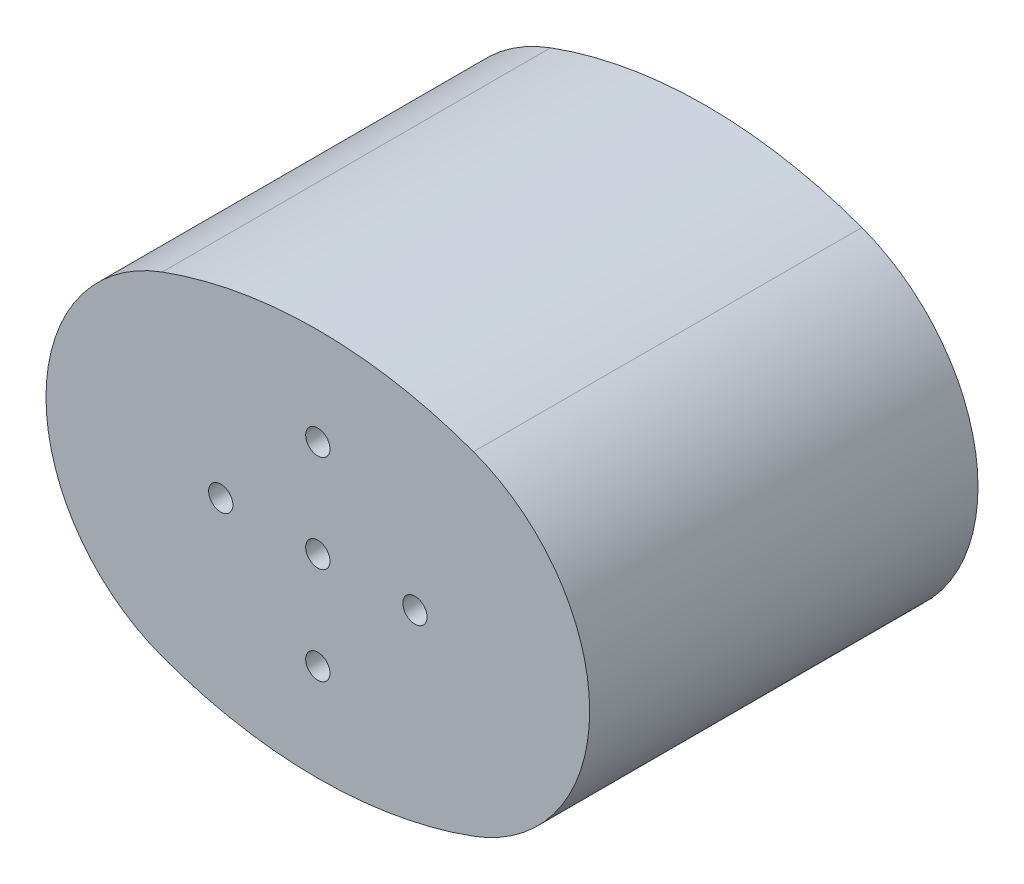
ISO-10303-21;
HEADER;
FILE_DESCRIPTION(('STEP AP214'),'2;1');
FILE_NAME('part.step','',(''),(''),'','','');
FILE_SCHEMA(('AUTOMOTIVE_DESIGN { 1 0 10303 214 1 1 1 1 }'));
ENDSEC;
DATA;
#1=APPLICATION_CONTEXT('core data for automotive mechanical design processes');
#2=APPLICATION_PROTOCOL_DEFINITION('international standard','automotive_design',2000,#1);
#3=PRODUCT_CONTEXT('',#1,'mechanical');
#4=PRODUCT('Part','Part','',(#3));
#5=PRODUCT_RELATED_PRODUCT_CATEGORY('part','',(#4));
#6=PRODUCT_DEFINITION_FORMATION('','',#4);
#7=PRODUCT_DEFINITION_CONTEXT('part definition',#1,'design');
#8=PRODUCT_DEFINITION('design','',#6,#7);
#9=PRODUCT_DEFINITION_SHAPE('','',#8);
#10=(LENGTH_UNIT() NAMED_UNIT(*) SI_UNIT(.MILLI.,.METRE.));
#11=(NAMED_UNIT(*) PLANE_ANGLE_UNIT() SI_UNIT($,.RADIAN.));
#12=(NAMED_UNIT(*) SI_UNIT($,.STERADIAN.) SOLID_ANGLE_UNIT());
#13=UNCERTAINTY_MEASURE_WITH_UNIT(LENGTH_MEASURE(1.E-05),#10,'distance_accuracy_value','');
#14=(GEOMETRIC_REPRESENTATION_CONTEXT(3) GLOBAL_UNCERTAINTY_ASSIGNED_CONTEXT((#13)) GLOBAL_UNIT_ASSIGNED_CONTEXT((#10,
#11,#12)) REPRESENTATION_CONTEXT('',''));
#15=CARTESIAN_POINT('',(0.,0.,0.));
#16=DIRECTION('',(0.,0.,1.));
#17=DIRECTION('',(1.,0.,0.));
#18=AXIS2_PLACEMENT_3D('',#15,#16,#17);
#19=CARTESIAN_POINT('',(0.,26.4889586669029,40.));
#20=DIRECTION('',(0.,0.,-1.));
#21=DIRECTION('',(-1.,0.,0.));
#22=AXIS2_PLACEMENT_3D('',#19,#20,#21);
#23=CYLINDRICAL_SURFACE('',#22,46.4889586669031);
#24=CARTESIAN_POINT('',(0.,26.4889586669029,0.));
#25=DIRECTION('',(0.,0.,1.));
#26=DIRECTION('',(1.,0.,0.));
#27=AXIS2_PLACEMENT_3D('',#24,#25,#26);
#28=CIRCLE('',#27,46.4889586669031);
#29=CARTESIAN_POINT('',(-16.0303859502735,-17.1487544287475,0.));
#30=VERTEX_POINT('',#29);
#31=CARTESIAN_POINT('',(16.0303859502735,-17.1487544287475,0.));
#32=VERTEX_POINT('',#31);
#33=EDGE_CURVE('E95',#30,#32,#28,.T.);
#34=ORIENTED_EDGE('',*,*,#33,.T.);
#35=DIRECTION('',(0.,0.,-1.));
#36=VECTOR('',#35,1.);
#37=CARTESIAN_POINT('',(16.0303859502735,-17.1487544287475,40.));
#38=LINE('',#37,#36);
#39=CARTESIAN_POINT('',(16.0303859502735,-17.1487544287475,40.));
#40=VERTEX_POINT('',#39);
#41=EDGE_CURVE('E11',#40,#32,#38,.T.);
#42=ORIENTED_EDGE('',*,*,#41,.F.);
#43=CARTESIAN_POINT('',(0.,26.4889586669029,40.));
#44=DIRECTION('',(0.,0.,1.));
#45=DIRECTION('',(1.,0.,0.));
#46=AXIS2_PLACEMENT_3D('',#43,#44,#45);
#47=CIRCLE('',#46,46.4889586669031);
#48=CARTESIAN_POINT('',(-16.0303859502735,-17.1487544287475,40.));
#49=VERTEX_POINT('',#48);
#50=EDGE_CURVE('E83',#49,#40,#47,.T.);
#51=ORIENTED_EDGE('',*,*,#50,.F.);
#52=DIRECTION('',(0.,0.,-1.));
#53=VECTOR('',#52,1.);
#54=CARTESIAN_POINT('',(-16.0303859502735,-17.1487544287475,40.));
#55=LINE('',#54,#53);
#56=EDGE_CURVE('E91',#49,#30,#55,.T.);
#57=ORIENTED_EDGE('',*,*,#56,.T.);
#58=EDGE_LOOP('',(#34,#42,#51,#57));
#59=FACE_BOUND('',#58,.T.);
#60=ADVANCED_FACE('F32',(#59),#23,.T.);
#61=CARTESIAN_POINT('',(9.73076269878195,0.,40.));
#62=DIRECTION('',(0.,0.,-1.));
#63=DIRECTION('',(-1.,0.,0.));
#64=AXIS2_PLACEMENT_3D('',#61,#62,#63);
#65=CYLINDRICAL_SURFACE('',#64,18.2692373012181);
#66=CARTESIAN_POINT('',(9.73076269878195,0.,0.));
#67=DIRECTION('',(0.,0.,1.));
#68=DIRECTION('',(1.,0.,0.));
#69=AXIS2_PLACEMENT_3D('',#66,#67,#68);
#70=CIRCLE('',#69,18.2692373012181);
#71=CARTESIAN_POINT('',(16.0303859502735,17.1487544287475,0.));
#72=VERTEX_POINT('',#71);
#73=EDGE_CURVE('E87',#32,#72,#70,.T.);
#74=ORIENTED_EDGE('',*,*,#73,.T.);
#75=DIRECTION('',(0.,0.,-1.));
#76=VECTOR('',#75,1.);
#77=CARTESIAN_POINT('',(16.0303859502735,17.1487544287475,40.));
#78=LINE('',#77,#76);
#79=CARTESIAN_POINT('',(16.0303859502735,17.1487544287475,40.));
#80=VERTEX_POINT('',#79);
#81=EDGE_CURVE('E40',#80,#72,#78,.T.);
#82=ORIENTED_EDGE('',*,*,#81,.F.);
#83=CARTESIAN_POINT('',(9.73076269878195,0.,40.));
#84=DIRECTION('',(0.,0.,1.));
#85=DIRECTION('',(1.,0.,0.));
#86=AXIS2_PLACEMENT_3D('',#83,#84,#85);
#87=CIRCLE('',#86,18.2692373012181);
#88=EDGE_CURVE('E78',#40,#80,#87,.T.);
#89=ORIENTED_EDGE('',*,*,#88,.F.);
#90=ORIENTED_EDGE('',*,*,#41,.T.);
#91=EDGE_LOOP('',(#74,#82,#89,#90));
#92=FACE_BOUND('',#91,.T.);
#93=ADVANCED_FACE('F86',(#92),#65,.T.);
#94=CARTESIAN_POINT('',(0.,-26.4889586669029,40.));
#95=DIRECTION('',(0.,0.,-1.));
#96=DIRECTION('',(-1.,0.,0.));
#97=AXIS2_PLACEMENT_3D('',#94,#95,#96);
#98=CYLINDRICAL_SURFACE('',#97,46.4889586669031);
#99=CARTESIAN_POINT('',(0.,-26.4889586669029,0.));
#100=DIRECTION('',(0.,0.,1.));
#101=DIRECTION('',(1.,0.,0.));
#102=AXIS2_PLACEMENT_3D('',#99,#100,#101);
#103=CIRCLE('',#102,46.4889586669031);
#104=CARTESIAN_POINT('',(-16.0303859502735,17.1487544287475,0.));
#105=VERTEX_POINT('',#104);
#106=EDGE_CURVE('E65',#72,#105,#103,.T.);
#107=ORIENTED_EDGE('',*,*,#106,.T.);
#108=DIRECTION('',(0.,0.,-1.));
#109=VECTOR('',#108,1.);
#110=CARTESIAN_POINT('',(-16.0303859502735,17.1487544287475,40.));
#111=LINE('',#110,#109);
#112=CARTESIAN_POINT('',(-16.0303859502735,17.1487544287475,40.));
#113=VERTEX_POINT('',#112);
#114=EDGE_CURVE('E88',#113,#105,#111,.T.);
#115=ORIENTED_EDGE('',*,*,#114,.F.);
#116=CARTESIAN_POINT('',(0.,-26.4889586669029,40.));
#117=DIRECTION('',(0.,0.,1.));
#118=DIRECTION('',(1.,0.,0.));
#119=AXIS2_PLACEMENT_3D('',#116,#117,#118);
#120=CIRCLE('',#119,46.4889586669031);
#121=EDGE_CURVE('E81',#80,#113,#120,.T.);
#122=ORIENTED_EDGE('',*,*,#121,.F.);
#123=ORIENTED_EDGE('',*,*,#81,.T.);
#124=EDGE_LOOP('',(#107,#115,#122,#123));
#125=FACE_BOUND('',#124,.T.);
#126=ADVANCED_FACE('F89',(#125),#98,.T.);
#127=CARTESIAN_POINT('',(-9.73076269878195,0.,40.));
#128=DIRECTION('',(0.,0.,-1.));
#129=DIRECTION('',(-1.,0.,0.));
#130=AXIS2_PLACEMENT_3D('',#127,#128,#129);
#131=CYLINDRICAL_SURFACE('',#130,18.2692373012181);
#132=CARTESIAN_POINT('',(-9.73076269878195,0.,0.));
#133=DIRECTION('',(0.,0.,1.));
#134=DIRECTION('',(1.,0.,0.));
#135=AXIS2_PLACEMENT_3D('',#132,#133,#134);
#136=CIRCLE('',#135,18.2692373012181);
#137=EDGE_CURVE('E71',#105,#30,#136,.T.);
#138=ORIENTED_EDGE('',*,*,#137,.T.);
#139=ORIENTED_EDGE('',*,*,#56,.F.);
#140=CARTESIAN_POINT('',(-9.73076269878195,0.,40.));
#141=DIRECTION('',(0.,0.,1.));
#142=DIRECTION('',(1.,0.,0.));
#143=AXIS2_PLACEMENT_3D('',#140,#141,#142);
#144=CIRCLE('',#143,18.2692373012181);
#145=EDGE_CURVE('E48',#113,#49,#144,.T.);
#146=ORIENTED_EDGE('',*,*,#145,.F.);
#147=ORIENTED_EDGE('',*,*,#114,.T.);
#148=EDGE_LOOP('',(#138,#139,#146,#147));
#149=FACE_BOUND('',#148,.T.);
#150=ADVANCED_FACE('F103',(#149),#131,.T.);
#151=CARTESIAN_POINT('',(4.86538134939097,13.2444793334515,40.));
#152=DIRECTION('',(0.,0.,1.));
#153=DIRECTION('',(1.,0.,0.));
#154=AXIS2_PLACEMENT_3D('',#151,#152,#153);
#155=PLANE('',#154);
#156=CARTESIAN_POINT('',(0.,10.,40.));
#157=DIRECTION('',(0.,0.,1.));
#158=DIRECTION('',(1.,0.,0.));
#159=AXIS2_PLACEMENT_3D('',#156,#157,#158);
#160=CIRCLE('',#159,1.25);
#161=CARTESIAN_POINT('',(1.25,10.,40.));
#162=VERTEX_POINT('',#161);
#163=EDGE_CURVE('E122',#162,#162,#160,.T.);
#164=ORIENTED_EDGE('',*,*,#163,.F.);
#165=EDGE_LOOP('',(#164));
#166=FACE_BOUND('',#165,.T.);
#167=CARTESIAN_POINT('',(-10.,1.04744440165294E-13,40.));
#168=DIRECTION('',(0.,0.,1.));
#169=DIRECTION('',(1.,0.,0.));
#170=AXIS2_PLACEMENT_3D('',#167,#168,#169);
#171=CIRCLE('',#170,1.25);
#172=CARTESIAN_POINT('',(-8.75,1.04744440165294E-13,40.));
#173=VERTEX_POINT('',#172);
#174=EDGE_CURVE('E123',#173,#173,#171,.T.);
#175=ORIENTED_EDGE('',*,*,#174,.F.);
#176=EDGE_LOOP('',(#175));
#177=FACE_BOUND('',#176,.T.);
#178=CARTESIAN_POINT('',(0.,-10.,40.));
#179=DIRECTION('',(0.,0.,1.));
#180=DIRECTION('',(1.,0.,0.));
#181=AXIS2_PLACEMENT_3D('',#178,#179,#180);
#182=CIRCLE('',#181,1.25);
#183=CARTESIAN_POINT('',(1.24999999999993,-10.,40.));
#184=VERTEX_POINT('',#183);
#185=EDGE_CURVE('E129',#184,#184,#182,.T.);
#186=ORIENTED_EDGE('',*,*,#185,.F.);
#187=EDGE_LOOP('',(#186));
#188=FACE_BOUND('',#187,.T.);
#189=CARTESIAN_POINT('',(10.,0.,40.));
#190=DIRECTION('',(0.,0.,1.));
#191=DIRECTION('',(1.,0.,0.));
#192=AXIS2_PLACEMENT_3D('',#189,#190,#191);
#193=CIRCLE('',#192,1.25);
#194=CARTESIAN_POINT('',(11.25,0.,40.));
#195=VERTEX_POINT('',#194);
#196=EDGE_CURVE('E109',#195,#195,#193,.T.);
#197=ORIENTED_EDGE('',*,*,#196,.F.);
#198=EDGE_LOOP('',(#197));
#199=FACE_BOUND('',#198,.T.);
#200=CARTESIAN_POINT('',(0.,0.,40.));
#201=DIRECTION('',(0.,0.,1.));
#202=DIRECTION('',(1.,0.,0.));
#203=AXIS2_PLACEMENT_3D('',#200,#201,#202);
#204=CIRCLE('',#203,1.25);
#205=CARTESIAN_POINT('',(1.25,0.,40.));
#206=VERTEX_POINT('',#205);
#207=EDGE_CURVE('E116',#206,#206,#204,.T.);
#208=ORIENTED_EDGE('',*,*,#207,.F.);
#209=EDGE_LOOP('',(#208));
#210=FACE_BOUND('',#209,.T.);
#211=ORIENTED_EDGE('',*,*,#50,.T.);
#212=ORIENTED_EDGE('',*,*,#88,.T.);
#213=ORIENTED_EDGE('',*,*,#121,.T.);
#214=ORIENTED_EDGE('',*,*,#145,.T.);
#215=EDGE_LOOP('',(#211,#212,#213,#214));
#216=FACE_BOUND('',#215,.T.);
#217=ADVANCED_FACE('F79',(#166,#177,#188,#199,#210,#216),#155,.T.);
#218=CARTESIAN_POINT('',(4.86538134939097,13.2444793334515,0.));
#219=DIRECTION('',(0.,0.,1.));
#220=DIRECTION('',(1.,0.,0.));
#221=AXIS2_PLACEMENT_3D('',#218,#219,#220);
#222=PLANE('',#221);
#223=CARTESIAN_POINT('',(0.,10.,0.));
#224=DIRECTION('',(0.,0.,1.));
#225=DIRECTION('',(1.,0.,0.));
#226=AXIS2_PLACEMENT_3D('',#223,#224,#225);
#227=CIRCLE('',#226,1.25);
#228=CARTESIAN_POINT('',(1.25,10.,0.));
#229=VERTEX_POINT('',#228);
#230=EDGE_CURVE('E98',#229,#229,#227,.T.);
#231=ORIENTED_EDGE('',*,*,#230,.T.);
#232=EDGE_LOOP('',(#231));
#233=FACE_BOUND('',#232,.T.);
#234=CARTESIAN_POINT('',(-10.,1.04744440165294E-13,0.));
#235=DIRECTION('',(0.,0.,1.));
#236=DIRECTION('',(1.,0.,0.));
#237=AXIS2_PLACEMENT_3D('',#234,#235,#236);
#238=CIRCLE('',#237,1.25);
#239=CARTESIAN_POINT('',(-8.75,1.04744440165294E-13,0.));
#240=VERTEX_POINT('',#239);
#241=EDGE_CURVE('E126',#240,#240,#238,.T.);
#242=ORIENTED_EDGE('',*,*,#241,.T.);
#243=EDGE_LOOP('',(#242));
#244=FACE_BOUND('',#243,.T.);
#245=CARTESIAN_POINT('',(0.,-10.,0.));
#246=DIRECTION('',(0.,0.,1.));
#247=DIRECTION('',(1.,0.,0.));
#248=AXIS2_PLACEMENT_3D('',#245,#246,#247);
#249=CIRCLE('',#248,1.25);
#250=CARTESIAN_POINT('',(1.24999999999993,-10.,0.));
#251=VERTEX_POINT('',#250);
#252=EDGE_CURVE('E113',#251,#251,#249,.T.);
#253=ORIENTED_EDGE('',*,*,#252,.T.);
#254=EDGE_LOOP('',(#253));
#255=FACE_BOUND('',#254,.T.);
#256=CARTESIAN_POINT('',(10.,0.,0.));
#257=DIRECTION('',(0.,0.,1.));
#258=DIRECTION('',(1.,0.,0.));
#259=AXIS2_PLACEMENT_3D('',#256,#257,#258);
#260=CIRCLE('',#259,1.25);
#261=CARTESIAN_POINT('',(11.25,0.,0.));
#262=VERTEX_POINT('',#261);
#263=EDGE_CURVE('E112',#262,#262,#260,.T.);
#264=ORIENTED_EDGE('',*,*,#263,.T.);
#265=EDGE_LOOP('',(#264));
#266=FACE_BOUND('',#265,.T.);
#267=CARTESIAN_POINT('',(0.,0.,0.));
#268=DIRECTION('',(0.,0.,1.));
#269=DIRECTION('',(1.,0.,0.));
#270=AXIS2_PLACEMENT_3D('',#267,#268,#269);
#271=CIRCLE('',#270,1.25);
#272=CARTESIAN_POINT('',(1.25,0.,0.));
#273=VERTEX_POINT('',#272);
#274=EDGE_CURVE('E119',#273,#273,#271,.T.);
#275=ORIENTED_EDGE('',*,*,#274,.T.);
#276=EDGE_LOOP('',(#275));
#277=FACE_BOUND('',#276,.T.);
#278=ORIENTED_EDGE('',*,*,#33,.F.);
#279=ORIENTED_EDGE('',*,*,#137,.F.);
#280=ORIENTED_EDGE('',*,*,#106,.F.);
#281=ORIENTED_EDGE('',*,*,#73,.F.);
#282=EDGE_LOOP('',(#278,#279,#280,#281));
#283=FACE_BOUND('',#282,.T.);
#284=ADVANCED_FACE('F106',(#233,#244,#255,#266,#277,#283),#222,.F.);
#285=CARTESIAN_POINT('',(0.,0.,0.));
#286=DIRECTION('',(0.,0.,1.));
#287=DIRECTION('',(1.,0.,0.));
#288=AXIS2_PLACEMENT_3D('',#285,#286,#287);
#289=CYLINDRICAL_SURFACE('',#288,1.25);
#290=ORIENTED_EDGE('',*,*,#274,.F.);
#291=EDGE_LOOP('',(#290));
#292=FACE_BOUND('',#291,.T.);
#293=ORIENTED_EDGE('',*,*,#207,.T.);
#294=EDGE_LOOP('',(#293));
#295=FACE_BOUND('',#294,.T.);
#296=ADVANCED_FACE('F159',(#292,#295),#289,.F.);
#297=CARTESIAN_POINT('',(10.,0.,0.));
#298=DIRECTION('',(0.,0.,1.));
#299=DIRECTION('',(1.,0.,0.));
#300=AXIS2_PLACEMENT_3D('',#297,#298,#299);
#301=CYLINDRICAL_SURFACE('',#300,1.25);
#302=ORIENTED_EDGE('',*,*,#263,.F.);
#303=EDGE_LOOP('',(#302));
#304=FACE_BOUND('',#303,.T.);
#305=ORIENTED_EDGE('',*,*,#196,.T.);
#306=EDGE_LOOP('',(#305));
#307=FACE_BOUND('',#306,.T.);
#308=ADVANCED_FACE('F161',(#304,#307),#301,.F.);
#309=CARTESIAN_POINT('',(0.,-10.,0.));
#310=DIRECTION('',(0.,0.,1.));
#311=DIRECTION('',(1.,0.,0.));
#312=AXIS2_PLACEMENT_3D('',#309,#310,#311);
#313=CYLINDRICAL_SURFACE('',#312,1.25);
#314=ORIENTED_EDGE('',*,*,#252,.F.);
#315=EDGE_LOOP('',(#314));
#316=FACE_BOUND('',#315,.T.);
#317=ORIENTED_EDGE('',*,*,#185,.T.);
#318=EDGE_LOOP('',(#317));
#319=FACE_BOUND('',#318,.T.);
#320=ADVANCED_FACE('F168',(#316,#319),#313,.F.);
#321=CARTESIAN_POINT('',(-10.,1.04744440165294E-13,0.));
#322=DIRECTION('',(0.,0.,1.));
#323=DIRECTION('',(1.,0.,0.));
#324=AXIS2_PLACEMENT_3D('',#321,#322,#323);
#325=CYLINDRICAL_SURFACE('',#324,1.25);
#326=ORIENTED_EDGE('',*,*,#241,.F.);
#327=EDGE_LOOP('',(#326));
#328=FACE_BOUND('',#327,.T.);
#329=ORIENTED_EDGE('',*,*,#174,.T.);
#330=EDGE_LOOP('',(#329));
#331=FACE_BOUND('',#330,.T.);
#332=ADVANCED_FACE('F144',(#328,#331),#325,.F.);
#333=CARTESIAN_POINT('',(0.,10.,0.));
#334=DIRECTION('',(0.,0.,1.));
#335=DIRECTION('',(1.,0.,0.));
#336=AXIS2_PLACEMENT_3D('',#333,#334,#335);
#337=CYLINDRICAL_SURFACE('',#336,1.25);
#338=ORIENTED_EDGE('',*,*,#230,.F.);
#339=EDGE_LOOP('',(#338));
#340=FACE_BOUND('',#339,.T.);
#341=ORIENTED_EDGE('',*,*,#163,.T.);
#342=EDGE_LOOP('',(#341));
#343=FACE_BOUND('',#342,.T.);
#344=ADVANCED_FACE('F141',(#340,#343),#337,.F.);
#345=CLOSED_SHELL('',(#60,#93,#126,#150,#217,#284,#296,#308,#320,#332,#344));
#346=MANIFOLD_SOLID_BREP('B2',#345);
#347=ADVANCED_BREP_SHAPE_REPRESENTATION('',(#18,#346),#14);
#348=SHAPE_DEFINITION_REPRESENTATION(#9,#347);
ENDSEC;
END-ISO-10303-21;
